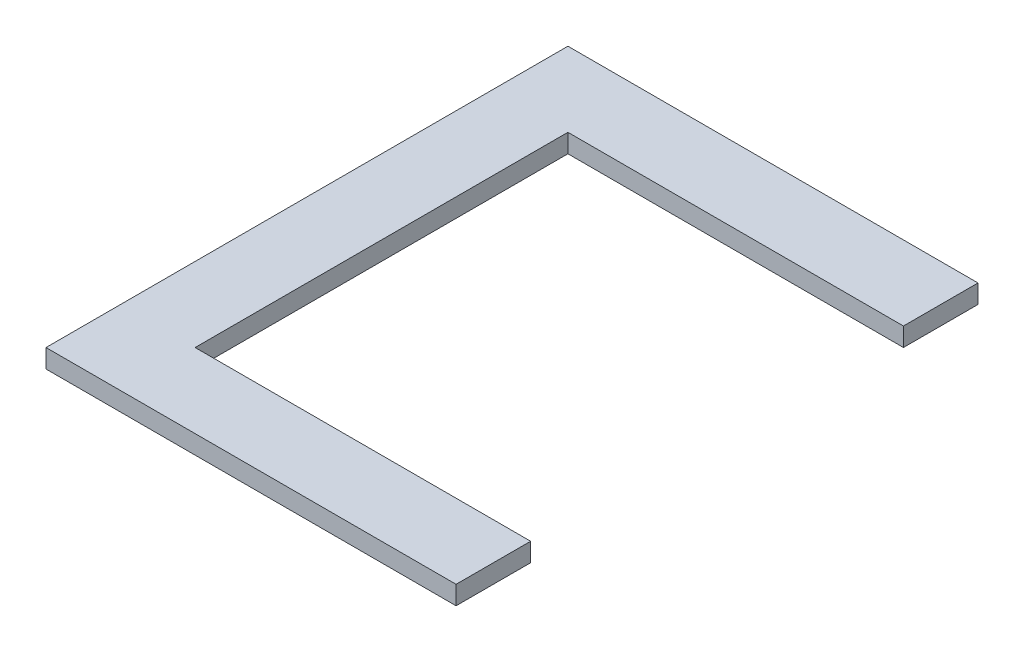
ISO-10303-21;
HEADER;
FILE_DESCRIPTION(('STEP AP214'),'2;1');
FILE_NAME('part.step','',(''),(''),'','','');
FILE_SCHEMA(('AUTOMOTIVE_DESIGN { 1 0 10303 214 1 1 1 1 }'));
ENDSEC;
DATA;
#1=APPLICATION_CONTEXT('core data for automotive mechanical design processes');
#2=APPLICATION_PROTOCOL_DEFINITION('international standard','automotive_design',2000,#1);
#3=PRODUCT_CONTEXT('',#1,'mechanical');
#4=PRODUCT('Part','Part','',(#3));
#5=PRODUCT_RELATED_PRODUCT_CATEGORY('part','',(#4));
#6=PRODUCT_DEFINITION_FORMATION('','',#4);
#7=PRODUCT_DEFINITION_CONTEXT('part definition',#1,'design');
#8=PRODUCT_DEFINITION('design','',#6,#7);
#9=PRODUCT_DEFINITION_SHAPE('','',#8);
#10=(LENGTH_UNIT() NAMED_UNIT(*) SI_UNIT(.MILLI.,.METRE.));
#11=(NAMED_UNIT(*) PLANE_ANGLE_UNIT() SI_UNIT($,.RADIAN.));
#12=(NAMED_UNIT(*) SI_UNIT($,.STERADIAN.) SOLID_ANGLE_UNIT());
#13=UNCERTAINTY_MEASURE_WITH_UNIT(LENGTH_MEASURE(1.E-05),#10,'distance_accuracy_value','');
#14=(GEOMETRIC_REPRESENTATION_CONTEXT(3) GLOBAL_UNCERTAINTY_ASSIGNED_CONTEXT((#13)) GLOBAL_UNIT_ASSIGNED_CONTEXT((#10,
#11,#12)) REPRESENTATION_CONTEXT('',''));
#15=CARTESIAN_POINT('',(0.,0.,0.));
#16=DIRECTION('',(0.,0.,1.));
#17=DIRECTION('',(1.,0.,0.));
#18=AXIS2_PLACEMENT_3D('',#15,#16,#17);
#19=CARTESIAN_POINT('',(63.5,3.175,-44.45));
#20=DIRECTION('',(0.,0.,1.));
#21=DIRECTION('',(1.,0.,0.));
#22=AXIS2_PLACEMENT_3D('',#19,#20,#21);
#23=PLANE('',#22);
#24=DIRECTION('',(-1.,0.,0.));
#25=VECTOR('',#24,1.);
#26=CARTESIAN_POINT('',(63.5,0.,-44.45));
#27=LINE('',#26,#25);
#28=CARTESIAN_POINT('',(63.5,0.,-44.45));
#29=VERTEX_POINT('',#28);
#30=CARTESIAN_POINT('',(-6.34999999999998,0.,-44.45));
#31=VERTEX_POINT('',#30);
#32=EDGE_CURVE('E130',#29,#31,#27,.T.);
#33=ORIENTED_EDGE('',*,*,#32,.T.);
#34=DIRECTION('',(0.,-1.,0.));
#35=VECTOR('',#34,1.);
#36=CARTESIAN_POINT('',(-6.34999999999998,3.175,-44.45));
#37=LINE('',#36,#35);
#38=CARTESIAN_POINT('',(-6.34999999999998,3.175,-44.45));
#39=VERTEX_POINT('',#38);
#40=EDGE_CURVE('E11',#39,#31,#37,.T.);
#41=ORIENTED_EDGE('',*,*,#40,.F.);
#42=DIRECTION('',(-1.,0.,0.));
#43=VECTOR('',#42,1.);
#44=CARTESIAN_POINT('',(63.5,3.175,-44.45));
#45=LINE('',#44,#43);
#46=CARTESIAN_POINT('',(63.5,3.175,-44.45));
#47=VERTEX_POINT('',#46);
#48=EDGE_CURVE('E144',#47,#39,#45,.T.);
#49=ORIENTED_EDGE('',*,*,#48,.F.);
#50=DIRECTION('',(0.,-1.,0.));
#51=VECTOR('',#50,1.);
#52=CARTESIAN_POINT('',(63.5,3.175,-44.45));
#53=LINE('',#52,#51);
#54=EDGE_CURVE('E126',#47,#29,#53,.T.);
#55=ORIENTED_EDGE('',*,*,#54,.T.);
#56=EDGE_LOOP('',(#33,#41,#49,#55));
#57=FACE_BOUND('',#56,.T.);
#58=ADVANCED_FACE('F34',(#57),#23,.F.);
#59=CARTESIAN_POINT('',(-6.34999999999998,3.175,-44.45));
#60=DIRECTION('',(1.,0.,0.));
#61=DIRECTION('',(0.,0.,-1.));
#62=AXIS2_PLACEMENT_3D('',#59,#60,#61);
#63=PLANE('',#62);
#64=DIRECTION('',(0.,0.,1.));
#65=VECTOR('',#64,1.);
#66=CARTESIAN_POINT('',(-6.34999999999998,0.,-44.45));
#67=LINE('',#66,#65);
#68=CARTESIAN_POINT('',(-6.34999999999998,0.,44.45));
#69=VERTEX_POINT('',#68);
#70=EDGE_CURVE('E133',#31,#69,#67,.T.);
#71=ORIENTED_EDGE('',*,*,#70,.T.);
#72=DIRECTION('',(0.,-1.,0.));
#73=VECTOR('',#72,1.);
#74=CARTESIAN_POINT('',(-6.34999999999998,3.175,44.45));
#75=LINE('',#74,#73);
#76=CARTESIAN_POINT('',(-6.34999999999998,3.175,44.45));
#77=VERTEX_POINT('',#76);
#78=EDGE_CURVE('E42',#77,#69,#75,.T.);
#79=ORIENTED_EDGE('',*,*,#78,.F.);
#80=DIRECTION('',(0.,0.,1.));
#81=VECTOR('',#80,1.);
#82=CARTESIAN_POINT('',(-6.34999999999998,3.175,-44.45));
#83=LINE('',#82,#81);
#84=EDGE_CURVE('E93',#39,#77,#83,.T.);
#85=ORIENTED_EDGE('',*,*,#84,.F.);
#86=ORIENTED_EDGE('',*,*,#40,.T.);
#87=EDGE_LOOP('',(#71,#79,#85,#86));
#88=FACE_BOUND('',#87,.T.);
#89=ADVANCED_FACE('F179',(#88),#63,.F.);
#90=CARTESIAN_POINT('',(-6.34999999999998,3.175,44.45));
#91=DIRECTION('',(0.,0.,-1.));
#92=DIRECTION('',(-1.,0.,0.));
#93=AXIS2_PLACEMENT_3D('',#90,#91,#92);
#94=PLANE('',#93);
#95=DIRECTION('',(1.,0.,0.));
#96=VECTOR('',#95,1.);
#97=CARTESIAN_POINT('',(-6.34999999999998,0.,44.45));
#98=LINE('',#97,#96);
#99=CARTESIAN_POINT('',(63.5,0.,44.45));
#100=VERTEX_POINT('',#99);
#101=EDGE_CURVE('E135',#69,#100,#98,.T.);
#102=ORIENTED_EDGE('',*,*,#101,.T.);
#103=DIRECTION('',(0.,-1.,0.));
#104=VECTOR('',#103,1.);
#105=CARTESIAN_POINT('',(63.5,3.175,44.45));
#106=LINE('',#105,#104);
#107=CARTESIAN_POINT('',(63.5,3.175,44.45));
#108=VERTEX_POINT('',#107);
#109=EDGE_CURVE('E151',#108,#100,#106,.T.);
#110=ORIENTED_EDGE('',*,*,#109,.F.);
#111=DIRECTION('',(1.,0.,0.));
#112=VECTOR('',#111,1.);
#113=CARTESIAN_POINT('',(-6.34999999999998,3.175,44.45));
#114=LINE('',#113,#112);
#115=EDGE_CURVE('E159',#77,#108,#114,.T.);
#116=ORIENTED_EDGE('',*,*,#115,.F.);
#117=ORIENTED_EDGE('',*,*,#78,.T.);
#118=EDGE_LOOP('',(#102,#110,#116,#117));
#119=FACE_BOUND('',#118,.T.);
#120=ADVANCED_FACE('F157',(#119),#94,.F.);
#121=CARTESIAN_POINT('',(63.5,3.175,44.45));
#122=DIRECTION('',(-1.,0.,0.));
#123=DIRECTION('',(0.,0.,1.));
#124=AXIS2_PLACEMENT_3D('',#121,#122,#123);
#125=PLANE('',#124);
#126=DIRECTION('',(0.,0.,-1.));
#127=VECTOR('',#126,1.);
#128=CARTESIAN_POINT('',(63.5,0.,44.45));
#129=LINE('',#128,#127);
#130=CARTESIAN_POINT('',(63.5,0.,31.75));
#131=VERTEX_POINT('',#130);
#132=EDGE_CURVE('E137',#100,#131,#129,.T.);
#133=ORIENTED_EDGE('',*,*,#132,.T.);
#134=DIRECTION('',(0.,-1.,0.));
#135=VECTOR('',#134,1.);
#136=CARTESIAN_POINT('',(63.5,3.175,31.75));
#137=LINE('',#136,#135);
#138=CARTESIAN_POINT('',(63.5,3.175,31.75));
#139=VERTEX_POINT('',#138);
#140=EDGE_CURVE('E148',#139,#131,#137,.T.);
#141=ORIENTED_EDGE('',*,*,#140,.F.);
#142=DIRECTION('',(0.,0.,-1.));
#143=VECTOR('',#142,1.);
#144=CARTESIAN_POINT('',(63.5,3.175,44.45));
#145=LINE('',#144,#143);
#146=EDGE_CURVE('E171',#108,#139,#145,.T.);
#147=ORIENTED_EDGE('',*,*,#146,.F.);
#148=ORIENTED_EDGE('',*,*,#109,.T.);
#149=EDGE_LOOP('',(#133,#141,#147,#148));
#150=FACE_BOUND('',#149,.T.);
#151=ADVANCED_FACE('F167',(#150),#125,.F.);
#152=CARTESIAN_POINT('',(6.35000000000002,3.175,31.75));
#153=DIRECTION('',(0.,0.,1.));
#154=DIRECTION('',(1.,0.,0.));
#155=AXIS2_PLACEMENT_3D('',#152,#153,#154);
#156=PLANE('',#155);
#157=DIRECTION('',(-1.,0.,0.));
#158=VECTOR('',#157,1.);
#159=CARTESIAN_POINT('',(6.35000000000002,0.,31.75));
#160=LINE('',#159,#158);
#161=CARTESIAN_POINT('',(6.35000000000002,0.,31.75));
#162=VERTEX_POINT('',#161);
#163=EDGE_CURVE('E139',#131,#162,#160,.T.);
#164=ORIENTED_EDGE('',*,*,#163,.T.);
#165=DIRECTION('',(0.,-1.,0.));
#166=VECTOR('',#165,1.);
#167=CARTESIAN_POINT('',(6.35000000000002,3.175,31.75));
#168=LINE('',#167,#166);
#169=CARTESIAN_POINT('',(6.35000000000002,3.175,31.75));
#170=VERTEX_POINT('',#169);
#171=EDGE_CURVE('E121',#170,#162,#168,.T.);
#172=ORIENTED_EDGE('',*,*,#171,.F.);
#173=DIRECTION('',(-1.,0.,0.));
#174=VECTOR('',#173,1.);
#175=CARTESIAN_POINT('',(6.35000000000002,3.175,31.75));
#176=LINE('',#175,#174);
#177=EDGE_CURVE('E112',#139,#170,#176,.T.);
#178=ORIENTED_EDGE('',*,*,#177,.F.);
#179=ORIENTED_EDGE('',*,*,#140,.T.);
#180=EDGE_LOOP('',(#164,#172,#178,#179));
#181=FACE_BOUND('',#180,.T.);
#182=ADVANCED_FACE('F170',(#181),#156,.F.);
#183=CARTESIAN_POINT('',(6.35000000000002,3.175,-31.75));
#184=DIRECTION('',(-1.,0.,0.));
#185=DIRECTION('',(0.,0.,1.));
#186=AXIS2_PLACEMENT_3D('',#183,#184,#185);
#187=PLANE('',#186);
#188=DIRECTION('',(0.,0.,-1.));
#189=VECTOR('',#188,1.);
#190=CARTESIAN_POINT('',(6.35000000000002,0.,-31.75));
#191=LINE('',#190,#189);
#192=CARTESIAN_POINT('',(6.35000000000002,0.,-31.75));
#193=VERTEX_POINT('',#192);
#194=EDGE_CURVE('E120',#162,#193,#191,.T.);
#195=ORIENTED_EDGE('',*,*,#194,.T.);
#196=DIRECTION('',(0.,-1.,0.));
#197=VECTOR('',#196,1.);
#198=CARTESIAN_POINT('',(6.35000000000002,3.175,-31.75));
#199=LINE('',#198,#197);
#200=CARTESIAN_POINT('',(6.35000000000002,3.175,-31.75));
#201=VERTEX_POINT('',#200);
#202=EDGE_CURVE('E117',#201,#193,#199,.T.);
#203=ORIENTED_EDGE('',*,*,#202,.F.);
#204=DIRECTION('',(0.,0.,-1.));
#205=VECTOR('',#204,1.);
#206=CARTESIAN_POINT('',(6.35000000000002,3.175,-31.75));
#207=LINE('',#206,#205);
#208=EDGE_CURVE('E106',#170,#201,#207,.T.);
#209=ORIENTED_EDGE('',*,*,#208,.F.);
#210=ORIENTED_EDGE('',*,*,#171,.T.);
#211=EDGE_LOOP('',(#195,#203,#209,#210));
#212=FACE_BOUND('',#211,.T.);
#213=ADVANCED_FACE('F118',(#212),#187,.F.);
#214=CARTESIAN_POINT('',(63.5,3.175,-31.75));
#215=DIRECTION('',(0.,0.,-1.));
#216=DIRECTION('',(-1.,0.,0.));
#217=AXIS2_PLACEMENT_3D('',#214,#215,#216);
#218=PLANE('',#217);
#219=DIRECTION('',(1.,0.,0.));
#220=VECTOR('',#219,1.);
#221=CARTESIAN_POINT('',(63.5,0.,-31.75));
#222=LINE('',#221,#220);
#223=CARTESIAN_POINT('',(63.5,0.,-31.75));
#224=VERTEX_POINT('',#223);
#225=EDGE_CURVE('E79',#193,#224,#222,.T.);
#226=ORIENTED_EDGE('',*,*,#225,.T.);
#227=DIRECTION('',(0.,-1.,0.));
#228=VECTOR('',#227,1.);
#229=CARTESIAN_POINT('',(63.5,3.175,-31.75));
#230=LINE('',#229,#228);
#231=CARTESIAN_POINT('',(63.5,3.175,-31.75));
#232=VERTEX_POINT('',#231);
#233=EDGE_CURVE('E122',#232,#224,#230,.T.);
#234=ORIENTED_EDGE('',*,*,#233,.F.);
#235=DIRECTION('',(1.,0.,0.));
#236=VECTOR('',#235,1.);
#237=CARTESIAN_POINT('',(63.5,3.175,-31.75));
#238=LINE('',#237,#236);
#239=EDGE_CURVE('E110',#201,#232,#238,.T.);
#240=ORIENTED_EDGE('',*,*,#239,.F.);
#241=ORIENTED_EDGE('',*,*,#202,.T.);
#242=EDGE_LOOP('',(#226,#234,#240,#241));
#243=FACE_BOUND('',#242,.T.);
#244=ADVANCED_FACE('F124',(#243),#218,.F.);
#245=CARTESIAN_POINT('',(63.5,3.175,-31.75));
#246=DIRECTION('',(-1.,0.,0.));
#247=DIRECTION('',(0.,0.,1.));
#248=AXIS2_PLACEMENT_3D('',#245,#246,#247);
#249=PLANE('',#248);
#250=DIRECTION('',(0.,0.,-1.));
#251=VECTOR('',#250,1.);
#252=CARTESIAN_POINT('',(63.5,0.,-31.75));
#253=LINE('',#252,#251);
#254=EDGE_CURVE('E85',#224,#29,#253,.T.);
#255=ORIENTED_EDGE('',*,*,#254,.T.);
#256=ORIENTED_EDGE('',*,*,#54,.F.);
#257=DIRECTION('',(0.,0.,-1.));
#258=VECTOR('',#257,1.);
#259=CARTESIAN_POINT('',(63.5,3.175,-31.75));
#260=LINE('',#259,#258);
#261=EDGE_CURVE('E50',#232,#47,#260,.T.);
#262=ORIENTED_EDGE('',*,*,#261,.F.);
#263=ORIENTED_EDGE('',*,*,#233,.T.);
#264=EDGE_LOOP('',(#255,#256,#262,#263));
#265=FACE_BOUND('',#264,.T.);
#266=ADVANCED_FACE('F195',(#265),#249,.F.);
#267=CARTESIAN_POINT('',(0.,3.175,0.));
#268=DIRECTION('',(0.,1.,0.));
#269=DIRECTION('',(0.,0.,1.));
#270=AXIS2_PLACEMENT_3D('',#267,#268,#269);
#271=PLANE('',#270);
#272=ORIENTED_EDGE('',*,*,#48,.T.);
#273=ORIENTED_EDGE('',*,*,#84,.T.);
#274=ORIENTED_EDGE('',*,*,#115,.T.);
#275=ORIENTED_EDGE('',*,*,#146,.T.);
#276=ORIENTED_EDGE('',*,*,#177,.T.);
#277=ORIENTED_EDGE('',*,*,#208,.T.);
#278=ORIENTED_EDGE('',*,*,#239,.T.);
#279=ORIENTED_EDGE('',*,*,#261,.T.);
#280=EDGE_LOOP('',(#272,#273,#274,#275,#276,#277,#278,#279));
#281=FACE_BOUND('',#280,.T.);
#282=ADVANCED_FACE('F108',(#281),#271,.T.);
#283=CARTESIAN_POINT('',(0.,0.,0.));
#284=DIRECTION('',(0.,1.,0.));
#285=DIRECTION('',(0.,0.,1.));
#286=AXIS2_PLACEMENT_3D('',#283,#284,#285);
#287=PLANE('',#286);
#288=ORIENTED_EDGE('',*,*,#32,.F.);
#289=ORIENTED_EDGE('',*,*,#254,.F.);
#290=ORIENTED_EDGE('',*,*,#225,.F.);
#291=ORIENTED_EDGE('',*,*,#194,.F.);
#292=ORIENTED_EDGE('',*,*,#163,.F.);
#293=ORIENTED_EDGE('',*,*,#132,.F.);
#294=ORIENTED_EDGE('',*,*,#101,.F.);
#295=ORIENTED_EDGE('',*,*,#70,.F.);
#296=EDGE_LOOP('',(#288,#289,#290,#291,#292,#293,#294,#295));
#297=FACE_BOUND('',#296,.T.);
#298=ADVANCED_FACE('F163',(#297),#287,.F.);
#299=CLOSED_SHELL('',(#58,#89,#120,#151,#182,#213,#244,#266,#282,#298));
#300=MANIFOLD_SOLID_BREP('B2',#299);
#301=ADVANCED_BREP_SHAPE_REPRESENTATION('',(#18,#300),#14);
#302=SHAPE_DEFINITION_REPRESENTATION(#9,#301);
ENDSEC;
END-ISO-10303-21;
